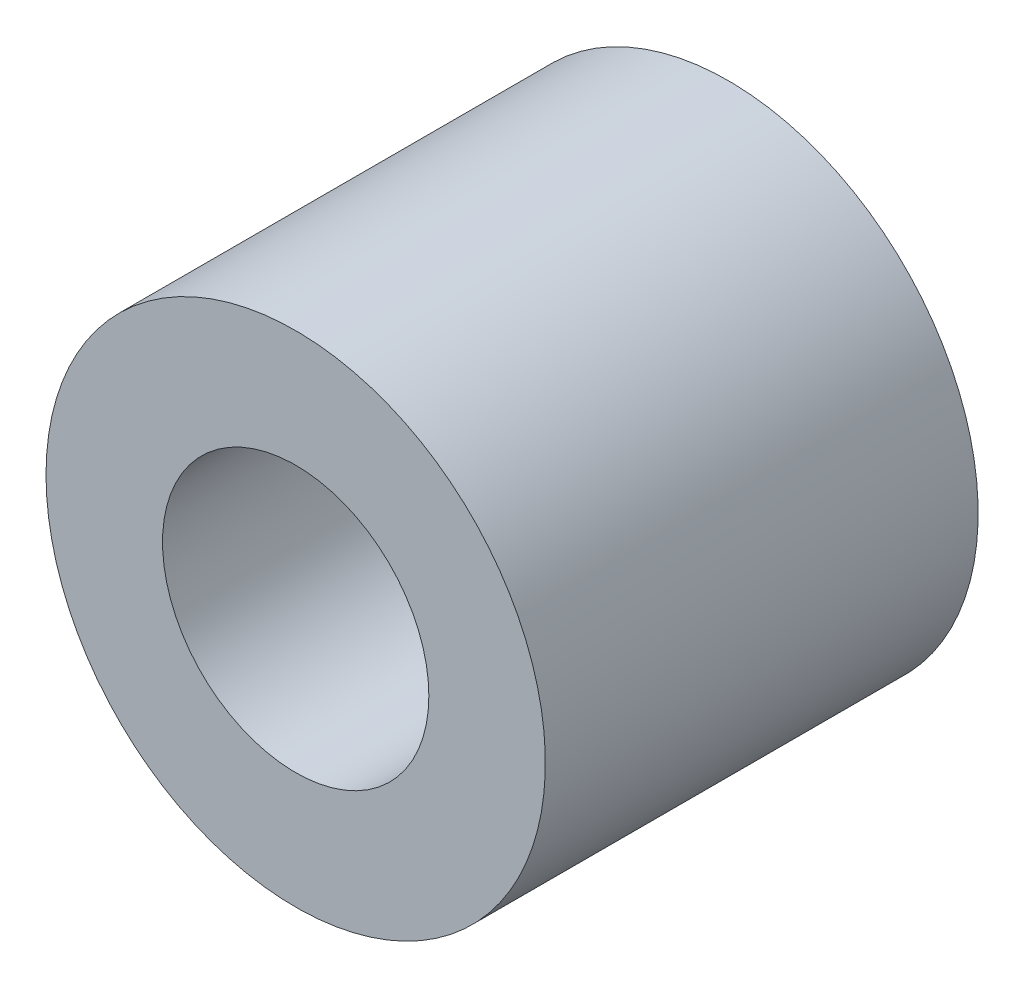
ISO-10303-21;
HEADER;
FILE_DESCRIPTION(('STEP AP214'),'2;1');
FILE_NAME('part.step','',(''),(''),'','','');
FILE_SCHEMA(('AUTOMOTIVE_DESIGN { 1 0 10303 214 1 1 1 1 }'));
ENDSEC;
DATA;
#1=APPLICATION_CONTEXT('core data for automotive mechanical design processes');
#2=APPLICATION_PROTOCOL_DEFINITION('international standard','automotive_design',2000,#1);
#3=PRODUCT_CONTEXT('',#1,'mechanical');
#4=PRODUCT('Part','Part','',(#3));
#5=PRODUCT_RELATED_PRODUCT_CATEGORY('part','',(#4));
#6=PRODUCT_DEFINITION_FORMATION('','',#4);
#7=PRODUCT_DEFINITION_CONTEXT('part definition',#1,'design');
#8=PRODUCT_DEFINITION('design','',#6,#7);
#9=PRODUCT_DEFINITION_SHAPE('','',#8);
#10=(LENGTH_UNIT() NAMED_UNIT(*) SI_UNIT(.MILLI.,.METRE.));
#11=(NAMED_UNIT(*) PLANE_ANGLE_UNIT() SI_UNIT($,.RADIAN.));
#12=(NAMED_UNIT(*) SI_UNIT($,.STERADIAN.) SOLID_ANGLE_UNIT());
#13=UNCERTAINTY_MEASURE_WITH_UNIT(LENGTH_MEASURE(1.E-05),#10,'distance_accuracy_value','');
#14=(GEOMETRIC_REPRESENTATION_CONTEXT(3) GLOBAL_UNCERTAINTY_ASSIGNED_CONTEXT((#13)) GLOBAL_UNIT_ASSIGNED_CONTEXT((#10,
#11,#12)) REPRESENTATION_CONTEXT('',''));
#15=CARTESIAN_POINT('',(0.,0.,0.));
#16=DIRECTION('',(0.,0.,1.));
#17=DIRECTION('',(1.,0.,0.));
#18=AXIS2_PLACEMENT_3D('',#15,#16,#17);
#19=CARTESIAN_POINT('',(2.25,0.,7.));
#20=DIRECTION('',(0.,0.,-1.));
#21=DIRECTION('',(-1.,0.,0.));
#22=AXIS2_PLACEMENT_3D('',#19,#20,#21);
#23=PLANE('',#22);
#24=CARTESIAN_POINT('',(0.,0.,7.));
#25=DIRECTION('',(0.,0.,1.));
#26=DIRECTION('',(1.,0.,0.));
#27=AXIS2_PLACEMENT_3D('',#24,#25,#26);
#28=CIRCLE('',#27,4.);
#29=CARTESIAN_POINT('',(4.,0.,7.));
#30=VERTEX_POINT('',#29);
#31=EDGE_CURVE('E18',#30,#30,#28,.T.);
#32=ORIENTED_EDGE('',*,*,#31,.T.);
#33=EDGE_LOOP('',(#32));
#34=FACE_BOUND('',#33,.T.);
#35=CARTESIAN_POINT('',(0.,0.,7.));
#36=DIRECTION('',(0.,0.,1.));
#37=DIRECTION('',(1.,0.,0.));
#38=AXIS2_PLACEMENT_3D('',#35,#36,#37);
#39=CIRCLE('',#38,2.25);
#40=CARTESIAN_POINT('',(2.25,0.,7.));
#41=VERTEX_POINT('',#40);
#42=EDGE_CURVE('E34',#41,#41,#39,.F.);
#43=ORIENTED_EDGE('',*,*,#42,.T.);
#44=EDGE_LOOP('',(#43));
#45=FACE_BOUND('',#44,.T.);
#46=ADVANCED_FACE('F15',(#34,#45),#23,.F.);
#47=CARTESIAN_POINT('',(0.,0.,13.));
#48=DIRECTION('',(0.,0.,1.));
#49=DIRECTION('',(1.,0.,0.));
#50=AXIS2_PLACEMENT_3D('',#47,#48,#49);
#51=CYLINDRICAL_SURFACE('',#50,4.);
#52=CARTESIAN_POINT('',(0.,0.,13.));
#53=DIRECTION('',(0.,0.,1.));
#54=DIRECTION('',(1.,0.,0.));
#55=AXIS2_PLACEMENT_3D('',#52,#53,#54);
#56=CIRCLE('',#55,4.);
#57=CARTESIAN_POINT('',(4.,0.,13.));
#58=VERTEX_POINT('',#57);
#59=EDGE_CURVE('E32',#58,#58,#56,.F.);
#60=ORIENTED_EDGE('',*,*,#59,.F.);
#61=EDGE_LOOP('',(#60));
#62=FACE_BOUND('',#61,.T.);
#63=ORIENTED_EDGE('',*,*,#31,.F.);
#64=EDGE_LOOP('',(#63));
#65=FACE_BOUND('',#64,.T.);
#66=ADVANCED_FACE('F42',(#62,#65),#51,.F.);
#67=CARTESIAN_POINT('',(0.,0.,13.));
#68=DIRECTION('',(0.,0.,1.));
#69=DIRECTION('',(1.,0.,0.));
#70=AXIS2_PLACEMENT_3D('',#67,#68,#69);
#71=CYLINDRICAL_SURFACE('',#70,2.25);
#72=CARTESIAN_POINT('',(0.,0.,0.));
#73=DIRECTION('',(0.,0.,1.));
#74=DIRECTION('',(1.,0.,0.));
#75=AXIS2_PLACEMENT_3D('',#72,#73,#74);
#76=CIRCLE('',#75,2.25);
#77=CARTESIAN_POINT('',(2.25,0.,0.));
#78=VERTEX_POINT('',#77);
#79=EDGE_CURVE('E27',#78,#78,#76,.F.);
#80=ORIENTED_EDGE('',*,*,#79,.T.);
#81=EDGE_LOOP('',(#80));
#82=FACE_BOUND('',#81,.T.);
#83=ORIENTED_EDGE('',*,*,#42,.F.);
#84=EDGE_LOOP('',(#83));
#85=FACE_BOUND('',#84,.T.);
#86=ADVANCED_FACE('F44',(#82,#85),#71,.F.);
#87=CARTESIAN_POINT('',(0.,0.,13.));
#88=DIRECTION('',(0.,0.,1.));
#89=DIRECTION('',(1.,0.,0.));
#90=AXIS2_PLACEMENT_3D('',#87,#88,#89);
#91=PLANE('',#90);
#92=CARTESIAN_POINT('',(0.,0.,13.));
#93=DIRECTION('',(0.,0.,-1.));
#94=DIRECTION('',(-1.,0.,0.));
#95=AXIS2_PLACEMENT_3D('',#92,#93,#94);
#96=CIRCLE('',#95,7.5);
#97=CARTESIAN_POINT('',(-7.5,0.,13.));
#98=VERTEX_POINT('',#97);
#99=EDGE_CURVE('E22',#98,#98,#96,.T.);
#100=ORIENTED_EDGE('',*,*,#99,.F.);
#101=EDGE_LOOP('',(#100));
#102=FACE_BOUND('',#101,.T.);
#103=ORIENTED_EDGE('',*,*,#59,.T.);
#104=EDGE_LOOP('',(#103));
#105=FACE_BOUND('',#104,.T.);
#106=ADVANCED_FACE('F51',(#102,#105),#91,.T.);
#107=CARTESIAN_POINT('',(0.,0.,0.));
#108=DIRECTION('',(0.,0.,1.));
#109=DIRECTION('',(1.,0.,0.));
#110=AXIS2_PLACEMENT_3D('',#107,#108,#109);
#111=PLANE('',#110);
#112=CARTESIAN_POINT('',(0.,0.,0.));
#113=DIRECTION('',(0.,0.,-1.));
#114=DIRECTION('',(-1.,0.,0.));
#115=AXIS2_PLACEMENT_3D('',#112,#113,#114);
#116=CIRCLE('',#115,7.5);
#117=CARTESIAN_POINT('',(-7.5,0.,0.));
#118=VERTEX_POINT('',#117);
#119=EDGE_CURVE('E10',#118,#118,#116,.F.);
#120=ORIENTED_EDGE('',*,*,#119,.F.);
#121=EDGE_LOOP('',(#120));
#122=FACE_BOUND('',#121,.T.);
#123=ORIENTED_EDGE('',*,*,#79,.F.);
#124=EDGE_LOOP('',(#123));
#125=FACE_BOUND('',#124,.T.);
#126=ADVANCED_FACE('F57',(#122,#125),#111,.F.);
#127=CARTESIAN_POINT('',(0.,0.,13.));
#128=DIRECTION('',(0.,0.,-1.));
#129=DIRECTION('',(-1.,0.,0.));
#130=AXIS2_PLACEMENT_3D('',#127,#128,#129);
#131=CYLINDRICAL_SURFACE('',#130,7.5);
#132=ORIENTED_EDGE('',*,*,#119,.T.);
#133=EDGE_LOOP('',(#132));
#134=FACE_BOUND('',#133,.T.);
#135=ORIENTED_EDGE('',*,*,#99,.T.);
#136=EDGE_LOOP('',(#135));
#137=FACE_BOUND('',#136,.T.);
#138=ADVANCED_FACE('F55',(#134,#137),#131,.T.);
#139=CLOSED_SHELL('',(#46,#66,#86,#106,#126,#138));
#140=MANIFOLD_SOLID_BREP('B1',#139);
#141=ADVANCED_BREP_SHAPE_REPRESENTATION('',(#18,#140),#14);
#142=SHAPE_DEFINITION_REPRESENTATION(#9,#141);
ENDSEC;
END-ISO-10303-21;
